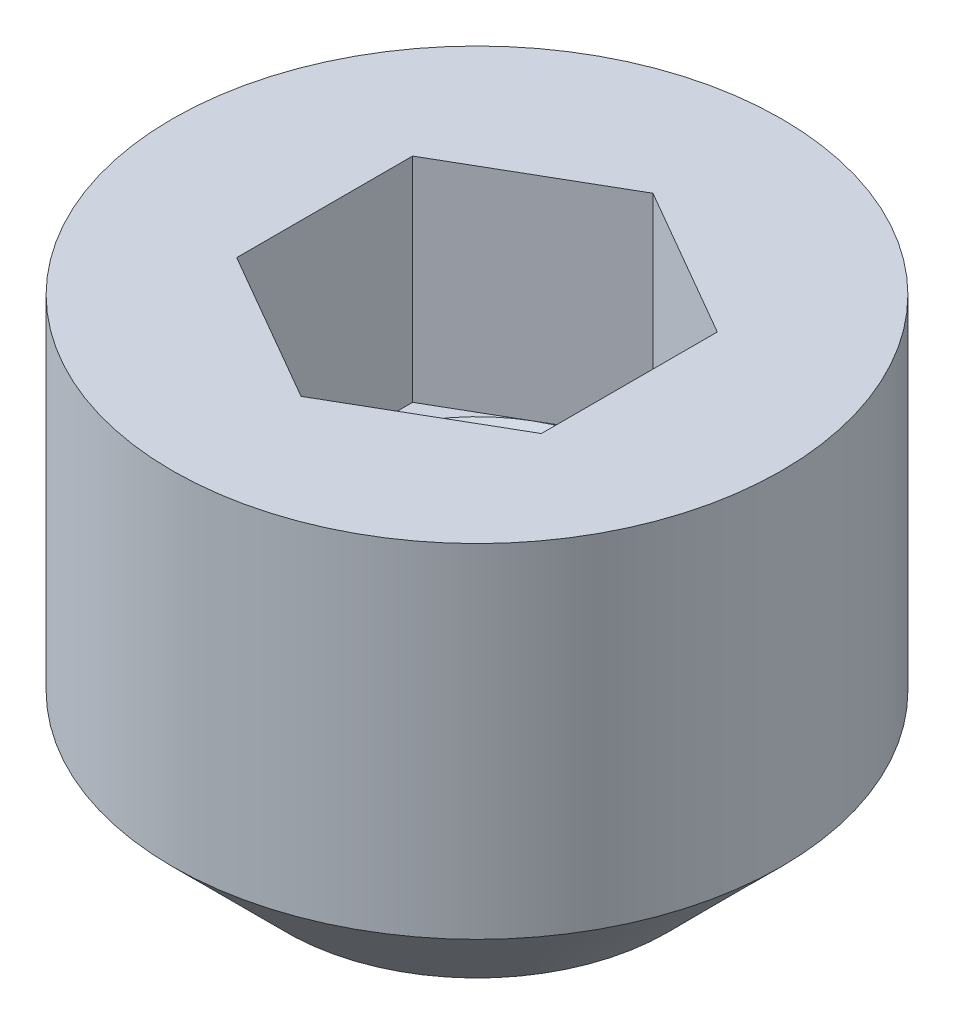
ISO-10303-21;
HEADER;
FILE_DESCRIPTION(('STEP AP214'),'2;1');
FILE_NAME('part.step','',(''),(''),'','','');
FILE_SCHEMA(('AUTOMOTIVE_DESIGN { 1 0 10303 214 1 1 1 1 }'));
ENDSEC;
DATA;
#1=APPLICATION_CONTEXT('core data for automotive mechanical design processes');
#2=APPLICATION_PROTOCOL_DEFINITION('international standard','automotive_design',2000,#1);
#3=PRODUCT_CONTEXT('',#1,'mechanical');
#4=PRODUCT('Part','Part','',(#3));
#5=PRODUCT_RELATED_PRODUCT_CATEGORY('part','',(#4));
#6=PRODUCT_DEFINITION_FORMATION('','',#4);
#7=PRODUCT_DEFINITION_CONTEXT('part definition',#1,'design');
#8=PRODUCT_DEFINITION('design','',#6,#7);
#9=PRODUCT_DEFINITION_SHAPE('','',#8);
#10=(LENGTH_UNIT() NAMED_UNIT(*) SI_UNIT(.MILLI.,.METRE.));
#11=(NAMED_UNIT(*) PLANE_ANGLE_UNIT() SI_UNIT($,.RADIAN.));
#12=(NAMED_UNIT(*) SI_UNIT($,.STERADIAN.) SOLID_ANGLE_UNIT());
#13=UNCERTAINTY_MEASURE_WITH_UNIT(LENGTH_MEASURE(1.E-05),#10,'distance_accuracy_value','');
#14=(GEOMETRIC_REPRESENTATION_CONTEXT(3) GLOBAL_UNCERTAINTY_ASSIGNED_CONTEXT((#13)) GLOBAL_UNIT_ASSIGNED_CONTEXT((#10,
#11,#12)) REPRESENTATION_CONTEXT('',''));
#15=CARTESIAN_POINT('',(0.,0.,0.));
#16=DIRECTION('',(0.,0.,1.));
#17=DIRECTION('',(1.,0.,0.));
#18=AXIS2_PLACEMENT_3D('',#15,#16,#17);
#19=CARTESIAN_POINT('',(0.,3.,0.));
#20=DIRECTION('',(0.,1.,0.));
#21=DIRECTION('',(-1.,0.,0.));
#22=AXIS2_PLACEMENT_3D('',#19,#20,#21);
#23=CYLINDRICAL_SURFACE('',#22,2.);
#24=CARTESIAN_POINT('',(0.,3.,0.));
#25=DIRECTION('',(0.,1.,0.));
#26=DIRECTION('',(-1.,0.,0.));
#27=AXIS2_PLACEMENT_3D('',#24,#25,#26);
#28=CIRCLE('',#27,2.);
#29=CARTESIAN_POINT('',(-2.,3.,0.));
#30=VERTEX_POINT('',#29);
#31=EDGE_CURVE('E11',#30,#30,#28,.T.);
#32=ORIENTED_EDGE('',*,*,#31,.F.);
#33=EDGE_LOOP('',(#32));
#34=FACE_BOUND('',#33,.T.);
#35=CARTESIAN_POINT('',(0.,0.749999999999992,0.));
#36=DIRECTION('',(0.,1.,0.));
#37=DIRECTION('',(-1.,0.,0.));
#38=AXIS2_PLACEMENT_3D('',#35,#36,#37);
#39=CIRCLE('',#38,2.);
#40=CARTESIAN_POINT('',(-2.,0.749999999999993,0.));
#41=VERTEX_POINT('',#40);
#42=EDGE_CURVE('E152',#41,#41,#39,.T.);
#43=ORIENTED_EDGE('',*,*,#42,.T.);
#44=EDGE_LOOP('',(#43));
#45=FACE_BOUND('',#44,.T.);
#46=ADVANCED_FACE('F36',(#34,#45),#23,.T.);
#47=CARTESIAN_POINT('',(0.,3.,0.));
#48=DIRECTION('',(0.,-1.,0.));
#49=DIRECTION('',(1.,0.,0.));
#50=AXIS2_PLACEMENT_3D('',#47,#48,#49);
#51=PLANE('',#50);
#52=ORIENTED_EDGE('',*,*,#31,.T.);
#53=EDGE_LOOP('',(#52));
#54=FACE_BOUND('',#53,.T.);
#55=DIRECTION('',(-0.866025403784439,0.,0.5));
#56=VECTOR('',#55,1.);
#57=CARTESIAN_POINT('',(0.,3.,-1.15470053837925));
#58=LINE('',#57,#56);
#59=CARTESIAN_POINT('',(0.,3.,-1.15470053837925));
#60=VERTEX_POINT('',#59);
#61=CARTESIAN_POINT('',(-1.,3.,-0.577350269189626));
#62=VERTEX_POINT('',#61);
#63=EDGE_CURVE('E151',#60,#62,#58,.T.);
#64=ORIENTED_EDGE('',*,*,#63,.F.);
#65=DIRECTION('',(-0.866025403784439,0.,-0.5));
#66=VECTOR('',#65,1.);
#67=CARTESIAN_POINT('',(1.,3.,-0.577350269189626));
#68=LINE('',#67,#66);
#69=CARTESIAN_POINT('',(1.,3.,-0.577350269189626));
#70=VERTEX_POINT('',#69);
#71=EDGE_CURVE('E51',#70,#60,#68,.T.);
#72=ORIENTED_EDGE('',*,*,#71,.F.);
#73=DIRECTION('',(0.,0.,-1.));
#74=VECTOR('',#73,1.);
#75=CARTESIAN_POINT('',(1.,3.,0.577350269189626));
#76=LINE('',#75,#74);
#77=CARTESIAN_POINT('',(1.,3.,0.577350269189626));
#78=VERTEX_POINT('',#77);
#79=EDGE_CURVE('E121',#78,#70,#76,.T.);
#80=ORIENTED_EDGE('',*,*,#79,.F.);
#81=DIRECTION('',(0.866025403784439,0.,-0.5));
#82=VECTOR('',#81,1.);
#83=CARTESIAN_POINT('',(0.,3.,1.15470053837925));
#84=LINE('',#83,#82);
#85=CARTESIAN_POINT('',(0.,3.,1.15470053837925));
#86=VERTEX_POINT('',#85);
#87=EDGE_CURVE('E159',#86,#78,#84,.T.);
#88=ORIENTED_EDGE('',*,*,#87,.F.);
#89=DIRECTION('',(0.866025403784439,0.,0.5));
#90=VECTOR('',#89,1.);
#91=CARTESIAN_POINT('',(-1.,3.,0.577350269189626));
#92=LINE('',#91,#90);
#93=CARTESIAN_POINT('',(-1.,3.,0.577350269189626));
#94=VERTEX_POINT('',#93);
#95=EDGE_CURVE('E156',#94,#86,#92,.T.);
#96=ORIENTED_EDGE('',*,*,#95,.F.);
#97=DIRECTION('',(0.,0.,1.));
#98=VECTOR('',#97,1.);
#99=CARTESIAN_POINT('',(-1.,3.,-0.577350269189626));
#100=LINE('',#99,#98);
#101=EDGE_CURVE('E154',#62,#94,#100,.T.);
#102=ORIENTED_EDGE('',*,*,#101,.F.);
#103=EDGE_LOOP('',(#64,#72,#80,#88,#96,#102));
#104=FACE_BOUND('',#103,.T.);
#105=ADVANCED_FACE('F199',(#54,#104),#51,.F.);
#106=CARTESIAN_POINT('',(1.,1.6,-0.577350269189626));
#107=DIRECTION('',(0.5,0.,-0.866025403784439));
#108=DIRECTION('',(-0.866025403784439,0.,-0.5));
#109=AXIS2_PLACEMENT_3D('',#106,#107,#108);
#110=PLANE('',#109);
#111=DIRECTION('',(-0.866025403784439,0.,-0.5));
#112=VECTOR('',#111,1.);
#113=CARTESIAN_POINT('',(1.,1.6,-0.577350269189626));
#114=LINE('',#113,#112);
#115=CARTESIAN_POINT('',(1.,1.6,-0.577350269189626));
#116=VERTEX_POINT('',#115);
#117=CARTESIAN_POINT('',(0.5,1.6,-0.866025403784439));
#118=VERTEX_POINT('',#117);
#119=EDGE_CURVE('E120',#116,#118,#114,.T.);
#120=ORIENTED_EDGE('',*,*,#119,.F.);
#121=DIRECTION('',(0.,1.,0.));
#122=VECTOR('',#121,1.);
#123=CARTESIAN_POINT('',(1.,1.6,-0.577350269189626));
#124=LINE('',#123,#122);
#125=EDGE_CURVE('E162',#116,#70,#124,.T.);
#126=ORIENTED_EDGE('',*,*,#125,.T.);
#127=ORIENTED_EDGE('',*,*,#71,.T.);
#128=DIRECTION('',(0.,1.,0.));
#129=VECTOR('',#128,1.);
#130=CARTESIAN_POINT('',(0.,1.6,-1.15470053837925));
#131=LINE('',#130,#129);
#132=CARTESIAN_POINT('',(0.,1.6,-1.15470053837925));
#133=VERTEX_POINT('',#132);
#134=EDGE_CURVE('E123',#133,#60,#131,.T.);
#135=ORIENTED_EDGE('',*,*,#134,.F.);
#136=EDGE_CURVE('E112',#118,#133,#114,.T.);
#137=ORIENTED_EDGE('',*,*,#136,.F.);
#138=EDGE_LOOP('',(#120,#126,#127,#135,#137));
#139=FACE_BOUND('',#138,.T.);
#140=ADVANCED_FACE('F124',(#139),#110,.F.);
#141=CARTESIAN_POINT('',(1.,1.6,0.577350269189626));
#142=DIRECTION('',(1.,0.,0.));
#143=DIRECTION('',(0.,0.,-1.));
#144=AXIS2_PLACEMENT_3D('',#141,#142,#143);
#145=PLANE('',#144);
#146=DIRECTION('',(0.,0.,-1.));
#147=VECTOR('',#146,1.);
#148=CARTESIAN_POINT('',(1.,1.6,0.577350269189626));
#149=LINE('',#148,#147);
#150=CARTESIAN_POINT('',(1.,1.6,0.577350269189626));
#151=VERTEX_POINT('',#150);
#152=CARTESIAN_POINT('',(1.,1.6,0.));
#153=VERTEX_POINT('',#152);
#154=EDGE_CURVE('E128',#151,#153,#149,.T.);
#155=ORIENTED_EDGE('',*,*,#154,.F.);
#156=DIRECTION('',(0.,1.,0.));
#157=VECTOR('',#156,1.);
#158=CARTESIAN_POINT('',(1.,1.6,0.577350269189626));
#159=LINE('',#158,#157);
#160=EDGE_CURVE('E165',#151,#78,#159,.T.);
#161=ORIENTED_EDGE('',*,*,#160,.T.);
#162=ORIENTED_EDGE('',*,*,#79,.T.);
#163=ORIENTED_EDGE('',*,*,#125,.F.);
#164=EDGE_CURVE('E147',#153,#116,#149,.T.);
#165=ORIENTED_EDGE('',*,*,#164,.F.);
#166=EDGE_LOOP('',(#155,#161,#162,#163,#165));
#167=FACE_BOUND('',#166,.T.);
#168=ADVANCED_FACE('F193',(#167),#145,.F.);
#169=CARTESIAN_POINT('',(0.,1.6,1.15470053837925));
#170=DIRECTION('',(0.5,0.,0.866025403784438));
#171=DIRECTION('',(0.866025403784439,0.,-0.5));
#172=AXIS2_PLACEMENT_3D('',#169,#170,#171);
#173=PLANE('',#172);
#174=DIRECTION('',(0.866025403784439,0.,-0.5));
#175=VECTOR('',#174,1.);
#176=CARTESIAN_POINT('',(0.,1.6,1.15470053837925));
#177=LINE('',#176,#175);
#178=CARTESIAN_POINT('',(0.,1.6,1.15470053837925));
#179=VERTEX_POINT('',#178);
#180=CARTESIAN_POINT('',(0.5,1.6,0.866025403784439));
#181=VERTEX_POINT('',#180);
#182=EDGE_CURVE('E59',#179,#181,#177,.T.);
#183=ORIENTED_EDGE('',*,*,#182,.F.);
#184=DIRECTION('',(0.,1.,0.));
#185=VECTOR('',#184,1.);
#186=CARTESIAN_POINT('',(0.,1.6,1.15470053837925));
#187=LINE('',#186,#185);
#188=EDGE_CURVE('E168',#179,#86,#187,.T.);
#189=ORIENTED_EDGE('',*,*,#188,.T.);
#190=ORIENTED_EDGE('',*,*,#87,.T.);
#191=ORIENTED_EDGE('',*,*,#160,.F.);
#192=EDGE_CURVE('E145',#181,#151,#177,.T.);
#193=ORIENTED_EDGE('',*,*,#192,.F.);
#194=EDGE_LOOP('',(#183,#189,#190,#191,#193));
#195=FACE_BOUND('',#194,.T.);
#196=ADVANCED_FACE('F242',(#195),#173,.F.);
#197=CARTESIAN_POINT('',(-1.,1.6,0.577350269189626));
#198=DIRECTION('',(-0.5,0.,0.866025403784439));
#199=DIRECTION('',(0.866025403784439,0.,0.5));
#200=AXIS2_PLACEMENT_3D('',#197,#198,#199);
#201=PLANE('',#200);
#202=DIRECTION('',(0.866025403784439,0.,0.5));
#203=VECTOR('',#202,1.);
#204=CARTESIAN_POINT('',(-1.,1.6,0.577350269189626));
#205=LINE('',#204,#203);
#206=CARTESIAN_POINT('',(-1.,1.6,0.577350269189626));
#207=VERTEX_POINT('',#206);
#208=CARTESIAN_POINT('',(-0.499999999999999,1.6,0.866025403784439));
#209=VERTEX_POINT('',#208);
#210=EDGE_CURVE('E142',#207,#209,#205,.T.);
#211=ORIENTED_EDGE('',*,*,#210,.F.);
#212=DIRECTION('',(0.,1.,0.));
#213=VECTOR('',#212,1.);
#214=CARTESIAN_POINT('',(-1.,1.6,0.577350269189626));
#215=LINE('',#214,#213);
#216=EDGE_CURVE('E171',#207,#94,#215,.T.);
#217=ORIENTED_EDGE('',*,*,#216,.T.);
#218=ORIENTED_EDGE('',*,*,#95,.T.);
#219=ORIENTED_EDGE('',*,*,#188,.F.);
#220=EDGE_CURVE('E141',#209,#179,#205,.T.);
#221=ORIENTED_EDGE('',*,*,#220,.F.);
#222=EDGE_LOOP('',(#211,#217,#218,#219,#221));
#223=FACE_BOUND('',#222,.T.);
#224=ADVANCED_FACE('F239',(#223),#201,.F.);
#225=CARTESIAN_POINT('',(-1.,1.6,-0.577350269189626));
#226=DIRECTION('',(-1.,0.,0.));
#227=DIRECTION('',(0.,-1.,0.));
#228=AXIS2_PLACEMENT_3D('',#225,#226,#227);
#229=PLANE('',#228);
#230=DIRECTION('',(0.,0.,1.));
#231=VECTOR('',#230,1.);
#232=CARTESIAN_POINT('',(-1.,1.6,-0.577350269189626));
#233=LINE('',#232,#231);
#234=CARTESIAN_POINT('',(-1.,1.6,-0.577350269189626));
#235=VERTEX_POINT('',#234);
#236=CARTESIAN_POINT('',(-1.,1.6,0.));
#237=VERTEX_POINT('',#236);
#238=EDGE_CURVE('E136',#235,#237,#233,.T.);
#239=ORIENTED_EDGE('',*,*,#238,.F.);
#240=DIRECTION('',(0.,1.,0.));
#241=VECTOR('',#240,1.);
#242=CARTESIAN_POINT('',(-1.,1.6,-0.577350269189626));
#243=LINE('',#242,#241);
#244=EDGE_CURVE('E127',#235,#62,#243,.T.);
#245=ORIENTED_EDGE('',*,*,#244,.T.);
#246=ORIENTED_EDGE('',*,*,#101,.T.);
#247=ORIENTED_EDGE('',*,*,#216,.F.);
#248=EDGE_CURVE('E134',#237,#207,#233,.T.);
#249=ORIENTED_EDGE('',*,*,#248,.F.);
#250=EDGE_LOOP('',(#239,#245,#246,#247,#249));
#251=FACE_BOUND('',#250,.T.);
#252=ADVANCED_FACE('F204',(#251),#229,.F.);
#253=CARTESIAN_POINT('',(0.,1.6,-1.15470053837925));
#254=DIRECTION('',(-0.5,0.,-0.866025403784438));
#255=DIRECTION('',(-0.866025403784439,0.,0.5));
#256=AXIS2_PLACEMENT_3D('',#253,#254,#255);
#257=PLANE('',#256);
#258=DIRECTION('',(-0.866025403784439,0.,0.5));
#259=VECTOR('',#258,1.);
#260=CARTESIAN_POINT('',(0.,1.6,-1.15470053837925));
#261=LINE('',#260,#259);
#262=CARTESIAN_POINT('',(-0.5,1.6,-0.866025403784439));
#263=VERTEX_POINT('',#262);
#264=EDGE_CURVE('E115',#133,#263,#261,.T.);
#265=ORIENTED_EDGE('',*,*,#264,.F.);
#266=ORIENTED_EDGE('',*,*,#134,.T.);
#267=ORIENTED_EDGE('',*,*,#63,.T.);
#268=ORIENTED_EDGE('',*,*,#244,.F.);
#269=EDGE_CURVE('E133',#263,#235,#261,.T.);
#270=ORIENTED_EDGE('',*,*,#269,.F.);
#271=EDGE_LOOP('',(#265,#266,#267,#268,#270));
#272=FACE_BOUND('',#271,.T.);
#273=ADVANCED_FACE('F131',(#272),#257,.F.);
#274=CARTESIAN_POINT('',(0.,1.6,0.));
#275=DIRECTION('',(0.,1.,0.));
#276=DIRECTION('',(0.,0.,1.));
#277=AXIS2_PLACEMENT_3D('',#274,#275,#276);
#278=PLANE('',#277);
#279=ORIENTED_EDGE('',*,*,#192,.T.);
#280=ORIENTED_EDGE('',*,*,#154,.T.);
#281=CARTESIAN_POINT('',(0.,1.6,0.));
#282=DIRECTION('',(0.,1.,0.));
#283=DIRECTION('',(-1.,0.,0.));
#284=AXIS2_PLACEMENT_3D('',#281,#282,#283);
#285=CIRCLE('',#284,1.);
#286=EDGE_CURVE('E180',#181,#153,#285,.T.);
#287=ORIENTED_EDGE('',*,*,#286,.F.);
#288=EDGE_LOOP('',(#279,#280,#287));
#289=FACE_BOUND('',#288,.T.);
#290=ADVANCED_FACE('F188',(#289),#278,.T.);
#291=ORIENTED_EDGE('',*,*,#164,.T.);
#292=ORIENTED_EDGE('',*,*,#119,.T.);
#293=EDGE_CURVE('E181',#153,#118,#285,.T.);
#294=ORIENTED_EDGE('',*,*,#293,.F.);
#295=EDGE_LOOP('',(#291,#292,#294));
#296=FACE_BOUND('',#295,.T.);
#297=ADVANCED_FACE('F197',(#296),#278,.T.);
#298=ORIENTED_EDGE('',*,*,#136,.T.);
#299=ORIENTED_EDGE('',*,*,#264,.T.);
#300=EDGE_CURVE('E117',#118,#263,#285,.T.);
#301=ORIENTED_EDGE('',*,*,#300,.F.);
#302=EDGE_LOOP('',(#298,#299,#301));
#303=FACE_BOUND('',#302,.T.);
#304=ADVANCED_FACE('F113',(#303),#278,.T.);
#305=ORIENTED_EDGE('',*,*,#269,.T.);
#306=ORIENTED_EDGE('',*,*,#238,.T.);
#307=EDGE_CURVE('E164',#263,#237,#285,.T.);
#308=ORIENTED_EDGE('',*,*,#307,.F.);
#309=EDGE_LOOP('',(#305,#306,#308));
#310=FACE_BOUND('',#309,.T.);
#311=ADVANCED_FACE('F208',(#310),#278,.T.);
#312=ORIENTED_EDGE('',*,*,#248,.T.);
#313=ORIENTED_EDGE('',*,*,#210,.T.);
#314=EDGE_CURVE('E44',#237,#209,#285,.T.);
#315=ORIENTED_EDGE('',*,*,#314,.F.);
#316=EDGE_LOOP('',(#312,#313,#315));
#317=FACE_BOUND('',#316,.T.);
#318=ADVANCED_FACE('F210',(#317),#278,.T.);
#319=ORIENTED_EDGE('',*,*,#220,.T.);
#320=ORIENTED_EDGE('',*,*,#182,.T.);
#321=EDGE_CURVE('E176',#209,#181,#285,.T.);
#322=ORIENTED_EDGE('',*,*,#321,.F.);
#323=EDGE_LOOP('',(#319,#320,#322));
#324=FACE_BOUND('',#323,.T.);
#325=ADVANCED_FACE('F216',(#324),#278,.T.);
#326=CARTESIAN_POINT('',(0.,1.02264973081037,0.));
#327=DIRECTION('',(0.,1.,0.));
#328=DIRECTION('',(-1.,0.,0.));
#329=AXIS2_PLACEMENT_3D('',#326,#327,#328);
#330=CONICAL_SURFACE('',#329,0.,1.04719755119659);
#331=ORIENTED_EDGE('',*,*,#314,.T.);
#332=ORIENTED_EDGE('',*,*,#321,.T.);
#333=ORIENTED_EDGE('',*,*,#286,.T.);
#334=ORIENTED_EDGE('',*,*,#293,.T.);
#335=ORIENTED_EDGE('',*,*,#300,.T.);
#336=ORIENTED_EDGE('',*,*,#307,.T.);
#337=EDGE_LOOP('',(#331,#332,#333,#334,#335,#336));
#338=FACE_BOUND('',#337,.T.);
#339=CARTESIAN_POINT('',(0.,1.02264973081037,0.));
#340=VERTEX_POINT('',#339);
#341=VERTEX_LOOP('',#340);
#342=FACE_BOUND('',#341,.T.);
#343=ADVANCED_FACE('F185',(#338,#342),#330,.F.);
#344=CARTESIAN_POINT('',(0.,0.749999999999992,0.));
#345=DIRECTION('',(0.,1.,0.));
#346=DIRECTION('',(-1.,0.,0.));
#347=AXIS2_PLACEMENT_3D('',#344,#345,#346);
#348=CONICAL_SURFACE('',#347,2.,0.785398163397453);
#349=CARTESIAN_POINT('',(0.,0.,0.));
#350=DIRECTION('',(0.,1.,0.));
#351=DIRECTION('',(-1.,0.,0.));
#352=AXIS2_PLACEMENT_3D('',#349,#350,#351);
#353=CIRCLE('',#352,1.25);
#354=CARTESIAN_POINT('',(-1.25,0.,0.));
#355=VERTEX_POINT('',#354);
#356=EDGE_CURVE('E334',#355,#355,#353,.T.);
#357=ORIENTED_EDGE('',*,*,#356,.T.);
#358=EDGE_LOOP('',(#357));
#359=FACE_BOUND('',#358,.T.);
#360=ORIENTED_EDGE('',*,*,#42,.F.);
#361=EDGE_LOOP('',(#360));
#362=FACE_BOUND('',#361,.T.);
#363=ADVANCED_FACE('F232',(#359,#362),#348,.T.);
#364=CARTESIAN_POINT('',(0.,0.,0.));
#365=DIRECTION('',(0.,1.,0.));
#366=DIRECTION('',(-1.,0.,0.));
#367=AXIS2_PLACEMENT_3D('',#364,#365,#366);
#368=PLANE('',#367);
#369=ORIENTED_EDGE('',*,*,#356,.F.);
#370=EDGE_LOOP('',(#369));
#371=FACE_BOUND('',#370,.T.);
#372=ADVANCED_FACE('F38',(#371),#368,.F.);
#373=CLOSED_SHELL('',(#46,#105,#140,#168,#196,#224,#252,#273,#290,#297,#304,#311,#318,#325,#343,
#363,#372));
#374=MANIFOLD_SOLID_BREP('B2',#373);
#375=ADVANCED_BREP_SHAPE_REPRESENTATION('',(#18,#374),#14);
#376=SHAPE_DEFINITION_REPRESENTATION(#9,#375);
ENDSEC;
END-ISO-10303-21;
